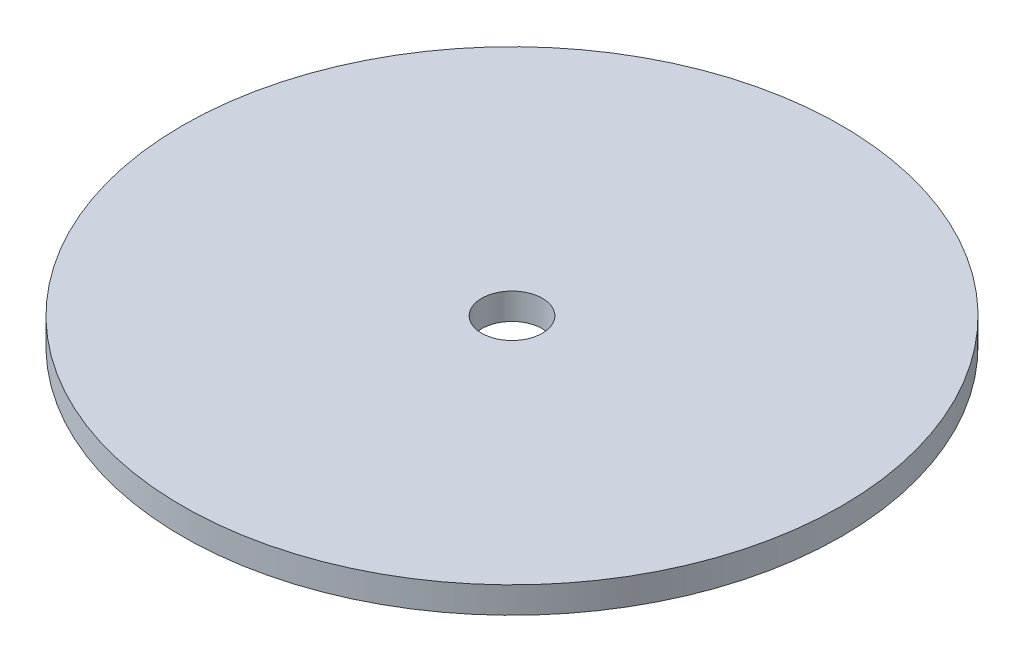
ISO-10303-21;
HEADER;
FILE_DESCRIPTION(('STEP AP214'),'2;1');
FILE_NAME('part.step','',(''),(''),'','','');
FILE_SCHEMA(('AUTOMOTIVE_DESIGN { 1 0 10303 214 1 1 1 1 }'));
ENDSEC;
DATA;
#1=APPLICATION_CONTEXT('core data for automotive mechanical design processes');
#2=APPLICATION_PROTOCOL_DEFINITION('international standard','automotive_design',2000,#1);
#3=PRODUCT_CONTEXT('',#1,'mechanical');
#4=PRODUCT('Part','Part','',(#3));
#5=PRODUCT_RELATED_PRODUCT_CATEGORY('part','',(#4));
#6=PRODUCT_DEFINITION_FORMATION('','',#4);
#7=PRODUCT_DEFINITION_CONTEXT('part definition',#1,'design');
#8=PRODUCT_DEFINITION('design','',#6,#7);
#9=PRODUCT_DEFINITION_SHAPE('','',#8);
#10=(LENGTH_UNIT() NAMED_UNIT(*) SI_UNIT(.MILLI.,.METRE.));
#11=(NAMED_UNIT(*) PLANE_ANGLE_UNIT() SI_UNIT($,.RADIAN.));
#12=(NAMED_UNIT(*) SI_UNIT($,.STERADIAN.) SOLID_ANGLE_UNIT());
#13=UNCERTAINTY_MEASURE_WITH_UNIT(LENGTH_MEASURE(1.E-05),#10,'distance_accuracy_value','');
#14=(GEOMETRIC_REPRESENTATION_CONTEXT(3) GLOBAL_UNCERTAINTY_ASSIGNED_CONTEXT((#13)) GLOBAL_UNIT_ASSIGNED_CONTEXT((#10,
#11,#12)) REPRESENTATION_CONTEXT('',''));
#15=CARTESIAN_POINT('',(0.,0.,0.));
#16=DIRECTION('',(0.,0.,1.));
#17=DIRECTION('',(1.,0.,0.));
#18=AXIS2_PLACEMENT_3D('',#15,#16,#17);
#19=CARTESIAN_POINT('',(0.,-3.79936595809411,0.));
#20=DIRECTION('',(0.,1.,0.));
#21=DIRECTION('',(-1.,0.,0.));
#22=AXIS2_PLACEMENT_3D('',#19,#20,#21);
#23=CYLINDRICAL_SURFACE('',#22,37.5);
#24=CARTESIAN_POINT('',(0.,-3.79936595809411,0.));
#25=DIRECTION('',(0.,-1.,0.));
#26=DIRECTION('',(1.,0.,0.));
#27=AXIS2_PLACEMENT_3D('',#24,#25,#26);
#28=CIRCLE('',#27,37.5);
#29=CARTESIAN_POINT('',(37.5,-3.79936595809411,0.));
#30=VERTEX_POINT('',#29);
#31=EDGE_CURVE('E10',#30,#30,#28,.T.);
#32=ORIENTED_EDGE('',*,*,#31,.F.);
#33=EDGE_LOOP('',(#32));
#34=FACE_BOUND('',#33,.T.);
#35=CARTESIAN_POINT('',(0.,-0.799365958094111,0.));
#36=DIRECTION('',(0.,-1.,0.));
#37=DIRECTION('',(1.,0.,0.));
#38=AXIS2_PLACEMENT_3D('',#35,#36,#37);
#39=CIRCLE('',#38,37.5);
#40=CARTESIAN_POINT('',(37.5,-0.799365958094111,0.));
#41=VERTEX_POINT('',#40);
#42=EDGE_CURVE('E41',#41,#41,#39,.T.);
#43=ORIENTED_EDGE('',*,*,#42,.T.);
#44=EDGE_LOOP('',(#43));
#45=FACE_BOUND('',#44,.T.);
#46=ADVANCED_FACE('F38',(#34,#45),#23,.T.);
#47=CARTESIAN_POINT('',(0.,-3.79936595809411,0.));
#48=DIRECTION('',(0.,-1.,0.));
#49=DIRECTION('',(1.,0.,0.));
#50=AXIS2_PLACEMENT_3D('',#47,#48,#49);
#51=PLANE('',#50);
#52=CARTESIAN_POINT('',(0.,-3.79936595809411,0.));
#53=DIRECTION('',(0.,-1.,0.));
#54=DIRECTION('',(1.,0.,0.));
#55=AXIS2_PLACEMENT_3D('',#52,#53,#54);
#56=CIRCLE('',#55,3.45);
#57=CARTESIAN_POINT('',(3.45,-3.79936595809411,0.));
#58=VERTEX_POINT('',#57);
#59=EDGE_CURVE('E52',#58,#58,#56,.T.);
#60=ORIENTED_EDGE('',*,*,#59,.F.);
#61=EDGE_LOOP('',(#60));
#62=FACE_BOUND('',#61,.T.);
#63=ORIENTED_EDGE('',*,*,#31,.T.);
#64=EDGE_LOOP('',(#63));
#65=FACE_BOUND('',#64,.T.);
#66=ADVANCED_FACE('F59',(#62,#65),#51,.T.);
#67=CARTESIAN_POINT('',(0.,-0.799365958094111,0.));
#68=DIRECTION('',(0.,-1.,0.));
#69=DIRECTION('',(1.,0.,0.));
#70=AXIS2_PLACEMENT_3D('',#67,#68,#69);
#71=PLANE('',#70);
#72=CARTESIAN_POINT('',(0.,-0.799365958094111,0.));
#73=DIRECTION('',(0.,-1.,0.));
#74=DIRECTION('',(1.,0.,0.));
#75=AXIS2_PLACEMENT_3D('',#72,#73,#74);
#76=CIRCLE('',#75,3.45);
#77=CARTESIAN_POINT('',(3.45,-0.799365958094111,0.));
#78=VERTEX_POINT('',#77);
#79=EDGE_CURVE('E48',#78,#78,#76,.F.);
#80=ORIENTED_EDGE('',*,*,#79,.F.);
#81=EDGE_LOOP('',(#80));
#82=FACE_BOUND('',#81,.T.);
#83=ORIENTED_EDGE('',*,*,#42,.F.);
#84=EDGE_LOOP('',(#83));
#85=FACE_BOUND('',#84,.T.);
#86=ADVANCED_FACE('F61',(#82,#85),#71,.F.);
#87=CARTESIAN_POINT('',(0.,-0.798365958094111,0.));
#88=DIRECTION('',(0.,-1.,0.));
#89=DIRECTION('',(1.,0.,0.));
#90=AXIS2_PLACEMENT_3D('',#87,#88,#89);
#91=CYLINDRICAL_SURFACE('',#90,3.45);
#92=CARTESIAN_POINT('',(3.45,-3.79936595809411,0.));
#93=CARTESIAN_POINT('',(3.45,-3.76811595809411,0.));
#94=CARTESIAN_POINT('',(3.45,-3.73686595809411,0.));
#95=CARTESIAN_POINT('',(3.45,-3.67436595809411,0.));
#96=CARTESIAN_POINT('',(3.45,-3.64311595809411,0.));
#97=CARTESIAN_POINT('',(3.45,-3.58061595809411,0.));
#98=CARTESIAN_POINT('',(3.45,-3.54936595809411,0.));
#99=CARTESIAN_POINT('',(3.45,-3.48686595809411,0.));
#100=CARTESIAN_POINT('',(3.45,-3.45561595809411,0.));
#101=CARTESIAN_POINT('',(3.45,-3.39311595809411,0.));
#102=CARTESIAN_POINT('',(3.45,-3.36186595809411,0.));
#103=CARTESIAN_POINT('',(3.45,-3.29936595809411,0.));
#104=CARTESIAN_POINT('',(3.45,-3.26811595809411,0.));
#105=CARTESIAN_POINT('',(3.45,-3.20561595809411,0.));
#106=CARTESIAN_POINT('',(3.45,-3.17436595809411,0.));
#107=CARTESIAN_POINT('',(3.45,-3.11186595809411,0.));
#108=CARTESIAN_POINT('',(3.45,-3.08061595809411,0.));
#109=CARTESIAN_POINT('',(3.45,-3.01811595809411,0.));
#110=CARTESIAN_POINT('',(3.45,-2.98686595809411,0.));
#111=CARTESIAN_POINT('',(3.45,-2.92436595809411,0.));
#112=CARTESIAN_POINT('',(3.45,-2.89311595809411,0.));
#113=CARTESIAN_POINT('',(3.45,-2.83061595809411,0.));
#114=CARTESIAN_POINT('',(3.45,-2.79936595809411,0.));
#115=CARTESIAN_POINT('',(3.45,-2.73686595809411,0.));
#116=CARTESIAN_POINT('',(3.45,-2.70561595809411,0.));
#117=CARTESIAN_POINT('',(3.45,-2.64311595809411,0.));
#118=CARTESIAN_POINT('',(3.45,-2.61186595809411,0.));
#119=CARTESIAN_POINT('',(3.45,-2.54936595809411,0.));
#120=CARTESIAN_POINT('',(3.45,-2.51811595809411,0.));
#121=CARTESIAN_POINT('',(3.45,-2.45561595809411,0.));
#122=CARTESIAN_POINT('',(3.45,-2.42436595809411,0.));
#123=CARTESIAN_POINT('',(3.45,-2.36186595809411,0.));
#124=CARTESIAN_POINT('',(3.45,-2.33061595809411,0.));
#125=CARTESIAN_POINT('',(3.45,-2.26811595809411,0.));
#126=CARTESIAN_POINT('',(3.45,-2.23686595809411,0.));
#127=CARTESIAN_POINT('',(3.45,-2.17436595809411,0.));
#128=CARTESIAN_POINT('',(3.45,-2.14311595809411,0.));
#129=CARTESIAN_POINT('',(3.45,-2.08061595809411,0.));
#130=CARTESIAN_POINT('',(3.45,-2.04936595809411,0.));
#131=CARTESIAN_POINT('',(3.45,-1.98686595809411,0.));
#132=CARTESIAN_POINT('',(3.45,-1.95561595809411,0.));
#133=CARTESIAN_POINT('',(3.45,-1.89311595809411,0.));
#134=CARTESIAN_POINT('',(3.45,-1.86186595809411,0.));
#135=CARTESIAN_POINT('',(3.45,-1.79936595809411,0.));
#136=CARTESIAN_POINT('',(3.45,-1.76811595809411,0.));
#137=CARTESIAN_POINT('',(3.45,-1.70561595809411,0.));
#138=CARTESIAN_POINT('',(3.45,-1.67436595809411,0.));
#139=CARTESIAN_POINT('',(3.45,-1.61186595809411,0.));
#140=CARTESIAN_POINT('',(3.45,-1.58061595809411,0.));
#141=CARTESIAN_POINT('',(3.45,-1.51811595809411,0.));
#142=CARTESIAN_POINT('',(3.45,-1.48686595809411,0.));
#143=CARTESIAN_POINT('',(3.45,-1.42436595809411,0.));
#144=CARTESIAN_POINT('',(3.45,-1.39311595809411,0.));
#145=CARTESIAN_POINT('',(3.45,-1.33061595809411,0.));
#146=CARTESIAN_POINT('',(3.45,-1.29936595809411,0.));
#147=CARTESIAN_POINT('',(3.45,-1.23686595809411,0.));
#148=CARTESIAN_POINT('',(3.45,-1.20561595809411,0.));
#149=CARTESIAN_POINT('',(3.45,-1.14311595809411,0.));
#150=CARTESIAN_POINT('',(3.45,-1.11186595809411,0.));
#151=CARTESIAN_POINT('',(3.45,-1.04936595809411,0.));
#152=CARTESIAN_POINT('',(3.45,-1.01811595809411,0.));
#153=CARTESIAN_POINT('',(3.45,-0.955615958094111,0.));
#154=CARTESIAN_POINT('',(3.45,-0.924365958094111,0.));
#155=CARTESIAN_POINT('',(3.45,-0.861865958094111,0.));
#156=CARTESIAN_POINT('',(3.45,-0.830615958094111,0.));
#157=CARTESIAN_POINT('',(3.45,-0.799365958094111,0.));
#158=B_SPLINE_CURVE_WITH_KNOTS('',3,(#92,#93,#94,#95,#96,#97,#98,#99,#100,#101,#102,#103,#104,
#105,#106,#107,#108,#109,#110,#111,#112,#113,#114,#115,#116,#117,#118,#119,#120,#121,#122,#123,
#124,#125,#126,#127,#128,#129,#130,#131,#132,#133,#134,#135,#136,#137,#138,#139,#140,#141,#142,
#143,#144,#145,#146,#147,#148,#149,#150,#151,#152,#153,#154,#155,#156,#157),.UNSPECIFIED.,.F.,
.F.,(4,2,2,2,2,2,2,2,2,2,2,2,2,2,2,2,2,2,2,2,2,2,2,2,2,2,2,2,2,2,2,2,4),(0.,0.0937500000000001,
0.1875,0.28125,0.375,0.46875,0.5625,0.65625,0.75,0.84375,0.9375,1.03125,1.125,1.21875,1.3125,
1.40625,1.5,1.59375,1.6875,1.78125,1.875,1.96875,2.0625,2.15625,2.25,2.34375,2.4375,2.53125,
2.625,2.71875,2.8125,2.90625,3.),.UNSPECIFIED.);
#159=EDGE_CURVE('BSEAM56',#58,#78,#158,.T.);
#160=ORIENTED_EDGE('',*,*,#59,.T.);
#161=ORIENTED_EDGE('',*,*,#79,.T.);
#162=ORIENTED_EDGE('',*,*,#159,.T.);
#163=ORIENTED_EDGE('',*,*,#159,.F.);
#164=EDGE_LOOP('',(#160,#162,#161,#163));
#165=FACE_BOUND('',#164,.T.);
#166=ADVANCED_FACE('F56',(#165),#91,.F.);
#167=CLOSED_SHELL('',(#46,#66,#86,#166));
#168=MANIFOLD_SOLID_BREP('B2',#167);
#169=ADVANCED_BREP_SHAPE_REPRESENTATION('',(#18,#168),#14);
#170=SHAPE_DEFINITION_REPRESENTATION(#9,#169);
ENDSEC;
END-ISO-10303-21;
